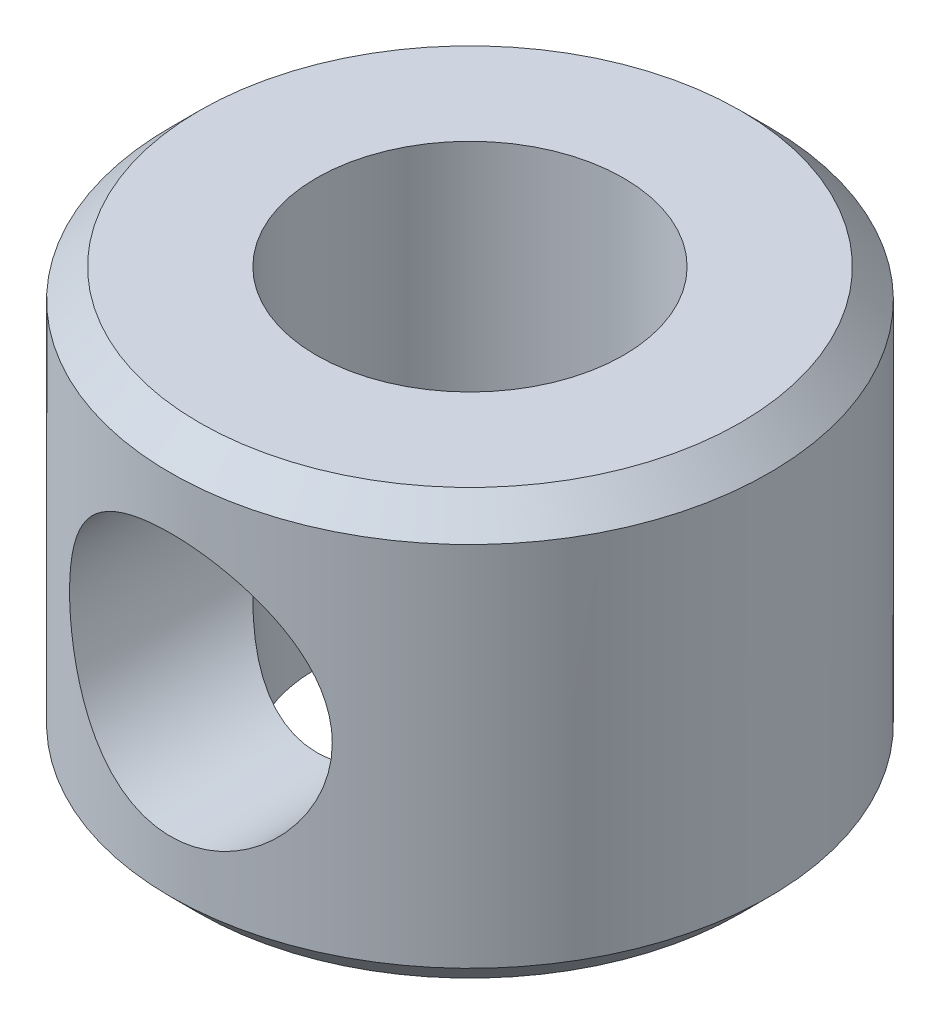
ISO-10303-21;
HEADER;
FILE_DESCRIPTION(('STEP AP214'),'2;1');
FILE_NAME('part.step','',(''),(''),'','','');
FILE_SCHEMA(('AUTOMOTIVE_DESIGN { 1 0 10303 214 1 1 1 1 }'));
ENDSEC;
DATA;
#1=APPLICATION_CONTEXT('core data for automotive mechanical design processes');
#2=APPLICATION_PROTOCOL_DEFINITION('international standard','automotive_design',2000,#1);
#3=PRODUCT_CONTEXT('',#1,'mechanical');
#4=PRODUCT('Part','Part','',(#3));
#5=PRODUCT_RELATED_PRODUCT_CATEGORY('part','',(#4));
#6=PRODUCT_DEFINITION_FORMATION('','',#4);
#7=PRODUCT_DEFINITION_CONTEXT('part definition',#1,'design');
#8=PRODUCT_DEFINITION('design','',#6,#7);
#9=PRODUCT_DEFINITION_SHAPE('','',#8);
#10=(LENGTH_UNIT() NAMED_UNIT(*) SI_UNIT(.MILLI.,.METRE.));
#11=(NAMED_UNIT(*) PLANE_ANGLE_UNIT() SI_UNIT($,.RADIAN.));
#12=(NAMED_UNIT(*) SI_UNIT($,.STERADIAN.) SOLID_ANGLE_UNIT());
#13=UNCERTAINTY_MEASURE_WITH_UNIT(LENGTH_MEASURE(1.E-05),#10,'distance_accuracy_value','');
#14=(GEOMETRIC_REPRESENTATION_CONTEXT(3) GLOBAL_UNCERTAINTY_ASSIGNED_CONTEXT((#13)) GLOBAL_UNIT_ASSIGNED_CONTEXT((#10,
#11,#12)) REPRESENTATION_CONTEXT('',''));
#15=CARTESIAN_POINT('',(0.,0.,0.));
#16=DIRECTION('',(0.,0.,1.));
#17=DIRECTION('',(1.,0.,0.));
#18=AXIS2_PLACEMENT_3D('',#15,#16,#17);
#19=CARTESIAN_POINT('',(0.,5.588,0.));
#20=DIRECTION('',(0.,1.,0.));
#21=DIRECTION('',(0.,0.,1.));
#22=AXIS2_PLACEMENT_3D('',#19,#20,#21);
#23=PLANE('',#22);
#24=CARTESIAN_POINT('',(0.,5.588,0.));
#25=DIRECTION('',(0.,1.,0.));
#26=DIRECTION('',(0.,0.,1.));
#27=AXIS2_PLACEMENT_3D('',#24,#25,#26);
#28=CIRCLE('',#27,3.556);
#29=CARTESIAN_POINT('',(0.,5.588,-3.556));
#30=VERTEX_POINT('',#29);
#31=EDGE_CURVE('E10',#30,#30,#28,.T.);
#32=ORIENTED_EDGE('',*,*,#31,.T.);
#33=EDGE_LOOP('',(#32));
#34=FACE_BOUND('',#33,.T.);
#35=CARTESIAN_POINT('',(0.,5.588,0.));
#36=DIRECTION('',(0.,1.,0.));
#37=DIRECTION('',(0.,0.,1.));
#38=AXIS2_PLACEMENT_3D('',#35,#36,#37);
#39=CIRCLE('',#38,2.0193);
#40=CARTESIAN_POINT('',(0.,5.588,2.0193));
#41=VERTEX_POINT('',#40);
#42=EDGE_CURVE('E53',#41,#41,#39,.T.);
#43=ORIENTED_EDGE('',*,*,#42,.F.);
#44=EDGE_LOOP('',(#43));
#45=FACE_BOUND('',#44,.T.);
#46=ADVANCED_FACE('F33',(#34,#45),#23,.T.);
#47=CARTESIAN_POINT('',(0.,0.,0.));
#48=DIRECTION('',(0.,1.,0.));
#49=DIRECTION('',(0.,0.,1.));
#50=AXIS2_PLACEMENT_3D('',#47,#48,#49);
#51=PLANE('',#50);
#52=CARTESIAN_POINT('',(0.,0.,0.));
#53=DIRECTION('',(0.,1.,0.));
#54=DIRECTION('',(0.,0.,1.));
#55=AXIS2_PLACEMENT_3D('',#52,#53,#54);
#56=CIRCLE('',#55,3.556);
#57=CARTESIAN_POINT('',(0.,0.,3.556));
#58=VERTEX_POINT('',#57);
#59=EDGE_CURVE('E40',#58,#58,#56,.F.);
#60=ORIENTED_EDGE('',*,*,#59,.T.);
#61=EDGE_LOOP('',(#60));
#62=FACE_BOUND('',#61,.T.);
#63=CARTESIAN_POINT('',(0.,0.,0.));
#64=DIRECTION('',(0.,1.,0.));
#65=DIRECTION('',(0.,0.,1.));
#66=AXIS2_PLACEMENT_3D('',#63,#64,#65);
#67=CIRCLE('',#66,2.0193);
#68=CARTESIAN_POINT('',(0.,0.,2.0193));
#69=VERTEX_POINT('',#68);
#70=EDGE_CURVE('E54',#69,#69,#67,.T.);
#71=ORIENTED_EDGE('',*,*,#70,.T.);
#72=EDGE_LOOP('',(#71));
#73=FACE_BOUND('',#72,.T.);
#74=ADVANCED_FACE('F86',(#62,#73),#51,.F.);
#75=CARTESIAN_POINT('',(0.,5.588,0.));
#76=DIRECTION('',(0.,-1.,0.));
#77=DIRECTION('',(0.,0.,-1.));
#78=AXIS2_PLACEMENT_3D('',#75,#76,#77);
#79=CYLINDRICAL_SURFACE('',#78,3.937);
#80=CARTESIAN_POINT('',(0.,0.381,0.));
#81=DIRECTION('',(0.,1.,0.));
#82=DIRECTION('',(0.,0.,1.));
#83=AXIS2_PLACEMENT_3D('',#80,#81,#82);
#84=CIRCLE('',#83,3.937);
#85=CARTESIAN_POINT('',(0.,0.381,3.937));
#86=VERTEX_POINT('',#85);
#87=EDGE_CURVE('E44',#86,#86,#84,.T.);
#88=ORIENTED_EDGE('',*,*,#87,.T.);
#89=EDGE_LOOP('',(#88));
#90=FACE_BOUND('',#89,.T.);
#91=CARTESIAN_POINT('',(0.,5.207,0.));
#92=DIRECTION('',(0.,1.,0.));
#93=DIRECTION('',(0.,0.,1.));
#94=AXIS2_PLACEMENT_3D('',#91,#92,#93);
#95=CIRCLE('',#94,3.937);
#96=CARTESIAN_POINT('',(0.,5.207,-3.937));
#97=VERTEX_POINT('',#96);
#98=EDGE_CURVE('E48',#97,#97,#95,.F.);
#99=ORIENTED_EDGE('',*,*,#98,.T.);
#100=EDGE_LOOP('',(#99));
#101=FACE_BOUND('',#100,.T.);
#102=CARTESIAN_POINT('',(1.72719999999999,2.794,3.53790180191593));
#103=CARTESIAN_POINT('',(1.72719578136646,2.7024016376137,3.53790636194648));
#104=CARTESIAN_POINT('',(1.71986710918652,2.6106517595193,3.54151059319829));
#105=CARTESIAN_POINT('',(1.69086860020965,2.42984349216496,3.55544353198954));
#106=CARTESIAN_POINT('',(1.66916183869725,2.34079265176102,3.56578955216563));
#107=CARTESIAN_POINT('',(1.61243634088037,2.16832231428566,3.59179310471308));
#108=CARTESIAN_POINT('',(1.5774758819706,2.08488002048414,3.60742735241412));
#109=CARTESIAN_POINT('',(1.49541007958023,1.92506699405684,3.6422104236138));
#110=CARTESIAN_POINT('',(1.44830669578914,1.8486951230693,3.6613586798596));
#111=CARTESIAN_POINT('',(1.33981128716781,1.6998665551408,3.70249124734506));
#112=CARTESIAN_POINT('',(1.27770800995274,1.62795643599403,3.72457812940021));
#113=CARTESIAN_POINT('',(1.14246583943478,1.49516265372648,3.76826075428827));
#114=CARTESIAN_POINT('',(1.06932243577436,1.4342835197004,3.78985629221771));
#115=CARTESIAN_POINT('',(0.90967961967382,1.32238264123839,3.83139303842346));
#116=CARTESIAN_POINT('',(0.822701328527197,1.27199021163004,3.85120130221964));
#117=CARTESIAN_POINT('',(0.64047404873173,1.18679308312858,3.88565812756723));
#118=CARTESIAN_POINT('',(0.545229137933002,1.15198075030437,3.90030921527728));
#119=CARTESIAN_POINT('',(0.354924766947638,1.10095767953889,3.92207088635899));
#120=CARTESIAN_POINT('',(0.26016365351529,1.08380048754502,3.92956338360354));
#121=CARTESIAN_POINT('',(0.068831711034894,1.06550187829506,3.93756049135947));
#122=CARTESIAN_POINT('',(-0.0277382788653182,1.06435321025091,3.93806826548077));
#123=CARTESIAN_POINT('',(-0.213008429663193,1.07764025899984,3.9322529791292));
#124=CARTESIAN_POINT('',(-0.301800658783986,1.09103181482094,3.92638756823651));
#125=CARTESIAN_POINT('',(-0.475727982981354,1.13120993901653,3.90912933956156));
#126=CARTESIAN_POINT('',(-0.560862806883595,1.15799749876825,3.89773611269267));
#127=CARTESIAN_POINT('',(-0.726636705184765,1.22450311346268,3.87028955957733));
#128=CARTESIAN_POINT('',(-0.807187197493588,1.26441250894124,3.85416768107325));
#129=CARTESIAN_POINT('',(-0.960659755835133,1.3558279801198,3.81881043414929));
#130=CARTESIAN_POINT('',(-1.03357903895009,1.40733826494881,3.79957393637176));
#131=CARTESIAN_POINT('',(-1.17568586735925,1.52508749736695,3.75814097959596));
#132=CARTESIAN_POINT('',(-1.24415493471844,1.59215459991236,3.7358306567057));
#133=CARTESIAN_POINT('',(-1.36920556647099,1.73681324990128,3.69183539022855));
#134=CARTESIAN_POINT('',(-1.42578150537489,1.81440974935861,3.67015074675508));
#135=CARTESIAN_POINT('',(-1.5275765085432,1.98178393487086,3.62899698396181));
#136=CARTESIAN_POINT('',(-1.57225503845083,2.07192310389925,3.60965012153974));
#137=CARTESIAN_POINT('',(-1.64549814918542,2.25951658594628,3.57686088290184));
#138=CARTESIAN_POINT('',(-1.67407569424658,2.35696494188245,3.56341375825564));
#139=CARTESIAN_POINT('',(-1.71237063120555,2.54919156019454,3.54516267760276));
#140=CARTESIAN_POINT('',(-1.72326183658091,2.64368391228285,3.53982248771774));
#141=CARTESIAN_POINT('',(-1.72935306428755,2.83327684376396,3.53685232051194));
#142=CARTESIAN_POINT('',(-1.72455957883244,2.92837715524563,3.53921915309534));
#143=CARTESIAN_POINT('',(-1.70049133957573,3.10901486473081,3.55083766610458));
#144=CARTESIAN_POINT('',(-1.68231968815421,3.19473758168268,3.55956441154722));
#145=CARTESIAN_POINT('',(-1.63351557432935,3.36182623868922,3.58222195583448));
#146=CARTESIAN_POINT('',(-1.60287998010348,3.44319107791814,3.59615406256151));
#147=CARTESIAN_POINT('',(-1.52852592105124,3.60329833461787,3.62839959101938));
#148=CARTESIAN_POINT('',(-1.48428777169807,3.68176467785478,3.64687983482992));
#149=CARTESIAN_POINT('',(-1.38448299933918,3.83056212126743,3.68592523967092));
#150=CARTESIAN_POINT('',(-1.32891112751769,3.90088942839467,3.70649136447748));
#151=CARTESIAN_POINT('',(-1.20199730573941,4.0381632954515,3.74967466595703));
#152=CARTESIAN_POINT('',(-1.12967438166987,4.10420214031616,3.77230631513249));
#153=CARTESIAN_POINT('',(-0.974478692303475,4.22339987476971,3.8153425855803));
#154=CARTESIAN_POINT('',(-0.891604602576628,4.27655714496887,3.83574692667262));
#155=CARTESIAN_POINT('',(-0.71659860010883,4.36865763623596,3.87227219045223));
#156=CARTESIAN_POINT('',(-0.624404603804402,4.4074962739555,3.88836137166293));
#157=CARTESIAN_POINT('',(-0.43389575520815,4.46879807590547,3.91419438820192));
#158=CARTESIAN_POINT('',(-0.335585033118831,4.49127216248817,3.92394245537765));
#159=CARTESIAN_POINT('',(-0.143699254144386,4.51772530270832,3.93546075025208));
#160=CARTESIAN_POINT('',(-0.050332096822271,4.52298012034782,3.93778096815972));
#161=CARTESIAN_POINT('',(0.135942220138784,4.51835888254217,3.9357536199203));
#162=CARTESIAN_POINT('',(0.228849472690083,4.50848601982432,3.9314074607253));
#163=CARTESIAN_POINT('',(0.4074768244704,4.47480234020419,3.91683939650717));
#164=CARTESIAN_POINT('',(0.493334611123565,4.45160072956129,3.90687464268251));
#165=CARTESIAN_POINT('',(0.659880986397444,4.39261995510419,3.8822183589674));
#166=CARTESIAN_POINT('',(0.740568648638172,4.35683854465773,3.86752598480881));
#167=CARTESIAN_POINT('',(0.898572300571057,4.27190357505996,3.83397428269574));
#168=CARTESIAN_POINT('',(0.97556452291919,4.22221254260366,3.81495490369934));
#169=CARTESIAN_POINT('',(1.12045489924413,4.11161737707065,3.77494487103505));
#170=CARTESIAN_POINT('',(1.18834926878758,4.05070860261028,3.75395340317555));
#171=CARTESIAN_POINT('',(1.31854250583964,3.91393214710406,3.71032120627444));
#172=CARTESIAN_POINT('',(1.38001508811418,3.83727624771165,3.68767724355635));
#173=CARTESIAN_POINT('',(1.48939181065832,3.67410187577887,3.64487893170298));
#174=CARTESIAN_POINT('',(1.53728770725598,3.58757745565737,3.62472609933481));
#175=CARTESIAN_POINT('',(1.61796147485701,3.4065811385561,3.58944596972011));
#176=CARTESIAN_POINT('',(1.65071375496308,3.31209610524189,3.57432719139729));
#177=CARTESIAN_POINT('',(1.69941888583905,3.11821678372103,3.5514350225845));
#178=CARTESIAN_POINT('',(1.71542809978052,3.01884015326411,3.5436369969474));
#179=CARTESIAN_POINT('',(1.72418701747825,2.89809974890275,3.53937088038802));
#180=CARTESIAN_POINT('',(1.72531580476767,2.8773019836575,3.53882111859567));
#181=CARTESIAN_POINT('',(1.72682278456591,2.83567209375932,3.538086056429));
#182=CARTESIAN_POINT('',(1.72720095980088,2.81483996832671,3.53790076444223));
#183=CARTESIAN_POINT('',(1.72719999999999,2.794,3.53790180191593));
#184=B_SPLINE_CURVE_WITH_KNOTS('',3,(#102,#103,#104,#105,#106,#107,#108,#109,#110,#111,#112,
#113,#114,#115,#116,#117,#118,#119,#120,#121,#122,#123,#124,#125,#126,#127,#128,#129,#130,#131,
#132,#133,#134,#135,#136,#137,#138,#139,#140,#141,#142,#143,#144,#145,#146,#147,#148,#149,#150,
#151,#152,#153,#154,#155,#156,#157,#158,#159,#160,#161,#162,#163,#164,#165,#166,#167,#168,#169,
#170,#171,#172,#173,#174,#175,#176,#177,#178,#179,#180,#181,#182,#183),.UNSPECIFIED.,.T.,.F.,(4,
2,2,2,2,2,2,2,2,2,2,2,2,2,2,2,2,2,2,2,2,2,2,2,2,2,2,2,2,2,2,2,2,2,2,2,2,2,2,2,4),(0.,
0.274707349570184,0.550122931179516,0.824341280022262,1.09851540173043,1.38989763764,
1.68139923932117,1.98718684994987,2.2928244663811,2.58105601742246,2.86915701465083,
3.13785883425388,3.40658054219792,3.67940869248241,3.95233599242769,4.24625671662661,
4.54031615503514,4.84605898564152,5.1515552843027,5.43579764084229,5.71992235855569,
5.98292386092073,6.24599148868849,6.52071898542373,6.79557400265047,7.09573985532693,
7.39594342339421,7.69829816531184,8.00045091820807,8.27964102726499,8.5587722208047,
8.8260590333658,9.09339360507067,9.37297436219694,9.65267105787219,9.95378020021283,
10.2550717842615,10.5568706707,10.8576502910953,10.920148796227,10.9826487396213),.UNSPECIFIED.);
#185=CARTESIAN_POINT('',(1.72719999999999,2.794,3.53790180191593));
#186=VERTEX_POINT('',#185);
#187=EDGE_CURVE('E57',#186,#186,#184,.T.);
#188=ORIENTED_EDGE('',*,*,#187,.T.);
#189=EDGE_LOOP('',(#188));
#190=FACE_BOUND('',#189,.T.);
#191=ADVANCED_FACE('F70',(#90,#101,#190),#79,.T.);
#192=CARTESIAN_POINT('',(0.,5.588,0.));
#193=DIRECTION('',(0.,-1.,0.));
#194=DIRECTION('',(0.,0.,-1.));
#195=AXIS2_PLACEMENT_3D('',#192,#193,#194);
#196=CYLINDRICAL_SURFACE('',#195,2.0193);
#197=CARTESIAN_POINT('',(1.72719999999999,2.794,1.04611311529873));
#198=CARTESIAN_POINT('',(1.72719490143661,2.73576844309427,1.0461274647811));
#199=CARTESIAN_POINT('',(1.72421647459769,2.67745150228154,1.05108699554495));
#200=CARTESIAN_POINT('',(1.71263466632947,2.56279314984262,1.06984301581214));
#201=CARTESIAN_POINT('',(1.70401293312214,2.50645881757991,1.08366833347032));
#202=CARTESIAN_POINT('',(1.67724024625527,2.37404361964166,1.12483314526991));
#203=CARTESIAN_POINT('',(1.65661655816458,2.29950435504454,1.1554025127468));
#204=CARTESIAN_POINT('',(1.60704987172466,2.15652346638667,1.22341472312371));
#205=CARTESIAN_POINT('',(1.5780770744767,2.08810485460568,1.26088200935185));
#206=CARTESIAN_POINT('',(1.52048869376134,1.97277581905698,1.3293546707161));
#207=CARTESIAN_POINT('',(1.49348482228963,1.92466846647927,1.35972840268099));
#208=CARTESIAN_POINT('',(1.43522140348022,1.83151298131925,1.42109338454971));
#209=CARTESIAN_POINT('',(1.40395979099097,1.78646634928302,1.45208492784788));
#210=CARTESIAN_POINT('',(1.30389310652754,1.65597755406202,1.54455457116541));
#211=CARTESIAN_POINT('',(1.22869930617726,1.57497353180294,1.60566260531388));
#212=CARTESIAN_POINT('',(1.07991538492477,1.44324043787693,1.70810850186691));
#213=CARTESIAN_POINT('',(1.00967138766211,1.38978186589409,1.75082455298089));
#214=CARTESIAN_POINT('',(0.859102228107089,1.29295315083882,1.82939544702507));
#215=CARTESIAN_POINT('',(0.778794101179817,1.24956630541883,1.86526163159258));
#216=CARTESIAN_POINT('',(0.624484849790804,1.18185857454801,1.92173734733727));
#217=CARTESIAN_POINT('',(0.5519589883456,1.15551025579397,1.94393189136831));
#218=CARTESIAN_POINT('',(0.402162290921864,1.11246987071728,1.98034416439809));
#219=CARTESIAN_POINT('',(0.324894280399367,1.09577211503297,1.99456659310245));
#220=CARTESIAN_POINT('',(0.167278771640995,1.07306934181262,2.01393134755255));
#221=CARTESIAN_POINT('',(0.0869185133912104,1.06711491798176,2.01903070898169));
#222=CARTESIAN_POINT('',(-0.0738748698904806,1.06650970809209,2.01954822723441));
#223=CARTESIAN_POINT('',(-0.154307986575374,1.07185775918797,2.01496737999784));
#224=CARTESIAN_POINT('',(-0.30651176777202,1.09261191459636,1.99726019406774));
#225=CARTESIAN_POINT('',(-0.378475136297033,1.10721950167716,1.98481250475286));
#226=CARTESIAN_POINT('',(-0.518505455399061,1.14486905171416,1.95291727008299));
#227=CARTESIAN_POINT('',(-0.586571773001247,1.16791238036883,1.93346859131623));
#228=CARTESIAN_POINT('',(-0.722718146575938,1.22342224602244,1.88701287788926));
#229=CARTESIAN_POINT('',(-0.790395660696693,1.25647776553297,1.85953914599945));
#230=CARTESIAN_POINT('',(-0.919175572180646,1.32981512476743,1.79937547122005));
#231=CARTESIAN_POINT('',(-0.980273042002485,1.37010232063299,1.76668166407838));
#232=CARTESIAN_POINT('',(-1.12452557626685,1.47855174063176,1.68023611914563));
#233=CARTESIAN_POINT('',(-1.2033919847821,1.5505659561039,1.62414172715919));
#234=CARTESIAN_POINT('',(-1.34574716159196,1.70617490164575,1.50829814457541));
#235=CARTESIAN_POINT('',(-1.4091995216346,1.78979633060972,1.44854071046531));
#236=CARTESIAN_POINT('',(-1.50868060943899,1.94905281911696,1.34369173330451));
#237=CARTESIAN_POINT('',(-1.54767191808622,2.02258645224114,1.29819089110842));
#238=CARTESIAN_POINT('',(-1.6154920468163,2.17715090068543,1.2127220715442));
#239=CARTESIAN_POINT('',(-1.64435192831964,2.25815782226011,1.17273741533149));
#240=CARTESIAN_POINT('',(-1.68129348028555,2.39486136677585,1.11868318824412));
#241=CARTESIAN_POINT('',(-1.69308073587456,2.44793677224035,1.10061279276609));
#242=CARTESIAN_POINT('',(-1.71171473137371,2.55675606697509,1.0714041915265));
#243=CARTESIAN_POINT('',(-1.7185741086381,2.61249273678443,1.06024826404748));
#244=CARTESIAN_POINT('',(-1.72680872558659,2.72607478038002,1.04679404895471));
#245=CARTESIAN_POINT('',(-1.72812781343399,2.78393577726538,1.04458646219577));
#246=CARTESIAN_POINT('',(-1.72496527685295,2.89907729951752,1.04979603891814));
#247=CARTESIAN_POINT('',(-1.72047835966395,2.9563572472016,1.05722198435368));
#248=CARTESIAN_POINT('',(-1.70485726089911,3.07893384003803,1.08225660934474));
#249=CARTESIAN_POINT('',(-1.69264181031349,3.14373964754103,1.10150252925887));
#250=CARTESIAN_POINT('',(-1.66183112217624,3.26911845427127,1.14745306152499));
#251=CARTESIAN_POINT('',(-1.64321321595574,3.32967548022376,1.17418411256654));
#252=CARTESIAN_POINT('',(-1.6039536616854,3.43683849816527,1.22711364818897));
#253=CARTESIAN_POINT('',(-1.5841617938252,3.48409104889836,1.25266312041268));
#254=CARTESIAN_POINT('',(-1.54092013319274,3.57589479045454,1.3054910818216));
#255=CARTESIAN_POINT('',(-1.51746803449672,3.62044425360868,1.33277065448415));
#256=CARTESIAN_POINT('',(-1.44175877913802,3.75036077822291,1.41580106941501));
#257=CARTESIAN_POINT('',(-1.38416740901084,3.83194598772611,1.47271659563318));
#258=CARTESIAN_POINT('',(-1.25183935131221,3.98862438081292,1.586985946746));
#259=CARTESIAN_POINT('',(-1.17640838674602,4.06321303392495,1.64422793975457));
#260=CARTESIAN_POINT('',(-1.01005483408408,4.19915760541749,1.75130866623137));
#261=CARTESIAN_POINT('',(-0.919178120136324,4.26055152375821,1.80116852713173));
#262=CARTESIAN_POINT('',(-0.752956187688139,4.35036307633038,1.87515161726863));
#263=CARTESIAN_POINT('',(-0.681379707613602,4.38312138680302,1.90248013885099));
#264=CARTESIAN_POINT('',(-0.532188900298439,4.4390911319054,1.94947277097149));
#265=CARTESIAN_POINT('',(-0.454578966911894,4.46230943799779,1.96914239751277));
#266=CARTESIAN_POINT('',(-0.294575988902298,4.4978777484021,1.99936576238263));
#267=CARTESIAN_POINT('',(-0.212154406397581,4.51015396763746,2.00985760406));
#268=CARTESIAN_POINT('',(-0.0457424074274087,4.52260561810379,2.02049960153998));
#269=CARTESIAN_POINT('',(0.0382472982499816,4.52278640477256,2.02065433425565));
#270=CARTESIAN_POINT('',(0.196058907830568,4.51166855296847,2.01115194656767));
#271=CARTESIAN_POINT('',(0.270032274129017,4.50155797538892,2.00251029977445));
#272=CARTESIAN_POINT('',(0.41481189027256,4.47227542740758,1.97760005443318));
#273=CARTESIAN_POINT('',(0.485617555072446,4.45310179064349,1.9613300533166));
#274=CARTESIAN_POINT('',(0.624927346670907,4.40591881735329,1.92157945031347));
#275=CARTESIAN_POINT('',(0.693270389573676,4.37763019604139,1.89787165673569));
#276=CARTESIAN_POINT('',(0.824038537444521,4.31369914287655,1.84486311685234));
#277=CARTESIAN_POINT('',(0.886461779339075,4.27805440705133,1.81556061847262));
#278=CARTESIAN_POINT('',(1.03338089505182,4.18192023354493,1.73768065183247));
#279=CARTESIAN_POINT('',(1.11411832311009,4.11771071485898,1.68659571672738));
#280=CARTESIAN_POINT('',(1.2616332317572,3.97801420604313,1.57930302438182));
#281=CARTESIAN_POINT('',(1.32835815766494,3.90248651852689,1.52307707804329));
#282=CARTESIAN_POINT('',(1.41840568785346,3.78088816709409,1.43786585355415));
#283=CARTESIAN_POINT('',(1.44698114360001,3.73850484809286,1.40902442580798));
#284=CARTESIAN_POINT('',(1.50044957520708,3.65103103031396,1.35194317940245));
#285=CARTESIAN_POINT('',(1.5253407457004,3.60593921943962,1.32370366145335));
#286=CARTESIAN_POINT('',(1.57124125363315,3.51309288507351,1.268876115692));
#287=CARTESIAN_POINT('',(1.5922632247163,3.46534771500348,1.24228290819672));
#288=CARTESIAN_POINT('',(1.63027792787041,3.36688212380661,1.19195588383812));
#289=CARTESIAN_POINT('',(1.64727564912009,3.31616548504447,1.16821854448851));
#290=CARTESIAN_POINT('',(1.67716243713512,3.2104463179086,1.12490195503999));
#291=CARTESIAN_POINT('',(1.68995918656485,3.15537681008275,1.10541893240029));
#292=CARTESIAN_POINT('',(1.71021129684565,3.04231188126822,1.07383106224524));
#293=CARTESIAN_POINT('',(1.71768938073446,2.98433005453405,1.06169486028756));
#294=CARTESIAN_POINT('',(1.72384607839945,2.90379644775402,1.0516344643562));
#295=CARTESIAN_POINT('',(1.72510068579278,2.88191368757558,1.04957290683701));
#296=CARTESIAN_POINT('',(1.72677874706906,2.83802471294631,1.04680929605864));
#297=CARTESIAN_POINT('',(1.72720192786388,2.81601846031283,1.04610768948626));
#298=CARTESIAN_POINT('',(1.72719999999999,2.794,1.04611311529873));
#299=B_SPLINE_CURVE_WITH_KNOTS('',3,(#197,#198,#199,#200,#201,#202,#203,#204,#205,#206,#207,
#208,#209,#210,#211,#212,#213,#214,#215,#216,#217,#218,#219,#220,#221,#222,#223,#224,#225,#226,
#227,#228,#229,#230,#231,#232,#233,#234,#235,#236,#237,#238,#239,#240,#241,#242,#243,#244,#245,
#246,#247,#248,#249,#250,#251,#252,#253,#254,#255,#256,#257,#258,#259,#260,#261,#262,#263,#264,
#265,#266,#267,#268,#269,#270,#271,#272,#273,#274,#275,#276,#277,#278,#279,#280,#281,#282,#283,
#284,#285,#286,#287,#288,#289,#290,#291,#292,#293,#294,#295,#296,#297,#298),.UNSPECIFIED.,.T.,
.F.,(4,2,2,2,2,2,2,2,2,2,2,2,2,2,2,2,2,2,2,2,2,2,2,2,2,2,2,2,2,2,2,2,2,2,2,2,2,2,2,2,2,2,2,2,2,
2,2,2,2,2,4),(0.,0.174594649546633,0.34975991289009,0.59784017076394,0.846817059839352,
1.03551613449905,1.22430706286045,1.60107676397295,1.89424759368795,2.18692871682637,
2.42681680591441,2.66656332751863,2.90743597237469,3.14828383646478,3.37075604783587,
3.59326429212909,3.83290640471296,4.07272674614636,4.43272147690684,4.79355842920102,
5.07742359369572,5.36041071003263,5.53176671909931,5.70268170825695,5.87532483320385,
6.04812545074213,6.2530707050615,6.45874919403824,6.63026490325519,6.80188910579447,
7.14531502914109,7.50534362424655,7.86432103861206,8.11334357838958,8.36218643675315,
8.61269487693474,8.86309239993807,9.08753270230785,9.31201428703224,9.54415912513515,
9.7763767828253,10.1198807511457,10.464650907376,10.6405836333275,10.8166022861397,
10.9920355946949,11.1672502523004,11.346091301137,11.5241636179369,11.5901595057585,
11.6561770667881),.UNSPECIFIED.);
#300=CARTESIAN_POINT('',(1.72719999999999,2.794,1.04611311529873));
#301=VERTEX_POINT('',#300);
#302=EDGE_CURVE('E66',#301,#301,#299,.T.);
#303=ORIENTED_EDGE('',*,*,#302,.F.);
#304=EDGE_LOOP('',(#303));
#305=FACE_BOUND('',#304,.T.);
#306=ORIENTED_EDGE('',*,*,#42,.T.);
#307=EDGE_LOOP('',(#306));
#308=FACE_BOUND('',#307,.T.);
#309=ORIENTED_EDGE('',*,*,#70,.F.);
#310=EDGE_LOOP('',(#309));
#311=FACE_BOUND('',#310,.T.);
#312=ADVANCED_FACE('F77',(#305,#308,#311),#196,.F.);
#313=CARTESIAN_POINT('',(0.,2.794,3.937));
#314=DIRECTION('',(0.,0.,1.));
#315=DIRECTION('',(1.,0.,0.));
#316=AXIS2_PLACEMENT_3D('',#313,#314,#315);
#317=CYLINDRICAL_SURFACE('',#316,1.72719999999999);
#318=ORIENTED_EDGE('',*,*,#302,.T.);
#319=EDGE_LOOP('',(#318));
#320=FACE_BOUND('',#319,.T.);
#321=ORIENTED_EDGE('',*,*,#187,.F.);
#322=EDGE_LOOP('',(#321));
#323=FACE_BOUND('',#322,.T.);
#324=ADVANCED_FACE('F73',(#320,#323),#317,.F.);
#325=CARTESIAN_POINT('',(0.,0.381,0.));
#326=DIRECTION('',(0.,1.,0.));
#327=DIRECTION('',(0.,0.,1.));
#328=AXIS2_PLACEMENT_3D('',#325,#326,#327);
#329=CONICAL_SURFACE('',#328,3.937,0.78539816339745);
#330=CARTESIAN_POINT('',(0.,0.,3.556));
#331=CARTESIAN_POINT('',(0.,0.00396875000000003,3.55996875));
#332=CARTESIAN_POINT('',(0.,0.00793750000000002,3.5639375));
#333=CARTESIAN_POINT('',(0.,0.015875,3.571875));
#334=CARTESIAN_POINT('',(0.,0.01984375,3.57584375));
#335=CARTESIAN_POINT('',(0.,0.02778125,3.58378125));
#336=CARTESIAN_POINT('',(0.,0.0317499999999999,3.58775));
#337=CARTESIAN_POINT('',(0.,0.0396875,3.5956875));
#338=CARTESIAN_POINT('',(0.,0.04365625,3.59965625));
#339=CARTESIAN_POINT('',(0.,0.05159375,3.60759375));
#340=CARTESIAN_POINT('',(0.,0.0555625,3.6115625));
#341=CARTESIAN_POINT('',(0.,0.0635,3.6195));
#342=CARTESIAN_POINT('',(0.,0.06746875,3.62346875));
#343=CARTESIAN_POINT('',(0.,0.07540625,3.63140625));
#344=CARTESIAN_POINT('',(0.,0.0793750000000001,3.635375));
#345=CARTESIAN_POINT('',(0.,0.0873125000000001,3.6433125));
#346=CARTESIAN_POINT('',(0.,0.09128125,3.64728125));
#347=CARTESIAN_POINT('',(0.,0.09921875,3.65521875));
#348=CARTESIAN_POINT('',(0.,0.1031875,3.6591875));
#349=CARTESIAN_POINT('',(0.,0.111125,3.667125));
#350=CARTESIAN_POINT('',(0.,0.11509375,3.67109375));
#351=CARTESIAN_POINT('',(0.,0.12303125,3.67903125));
#352=CARTESIAN_POINT('',(0.,0.127,3.683));
#353=CARTESIAN_POINT('',(0.,0.1349375,3.6909375));
#354=CARTESIAN_POINT('',(0.,0.13890625,3.69490625));
#355=CARTESIAN_POINT('',(0.,0.14684375,3.70284375));
#356=CARTESIAN_POINT('',(0.,0.1508125,3.7068125));
#357=CARTESIAN_POINT('',(0.,0.15875,3.71475));
#358=CARTESIAN_POINT('',(0.,0.16271875,3.71871875));
#359=CARTESIAN_POINT('',(0.,0.17065625,3.72665625));
#360=CARTESIAN_POINT('',(0.,0.174625,3.730625));
#361=CARTESIAN_POINT('',(0.,0.1825625,3.7385625));
#362=CARTESIAN_POINT('',(0.,0.18653125,3.74253125));
#363=CARTESIAN_POINT('',(0.,0.19446875,3.75046875));
#364=CARTESIAN_POINT('',(0.,0.1984375,3.7544375));
#365=CARTESIAN_POINT('',(0.,0.206375,3.762375));
#366=CARTESIAN_POINT('',(0.,0.21034375,3.76634375));
#367=CARTESIAN_POINT('',(0.,0.21828125,3.77428125));
#368=CARTESIAN_POINT('',(0.,0.22225,3.77825));
#369=CARTESIAN_POINT('',(0.,0.2301875,3.7861875));
#370=CARTESIAN_POINT('',(0.,0.23415625,3.79015625));
#371=CARTESIAN_POINT('',(0.,0.24209375,3.79809375));
#372=CARTESIAN_POINT('',(0.,0.2460625,3.8020625));
#373=CARTESIAN_POINT('',(0.,0.254,3.81));
#374=CARTESIAN_POINT('',(0.,0.25796875,3.81396875));
#375=CARTESIAN_POINT('',(0.,0.26590625,3.82190625));
#376=CARTESIAN_POINT('',(0.,0.269875,3.825875));
#377=CARTESIAN_POINT('',(0.,0.2778125,3.8338125));
#378=CARTESIAN_POINT('',(0.,0.28178125,3.83778125));
#379=CARTESIAN_POINT('',(0.,0.28971875,3.84571875));
#380=CARTESIAN_POINT('',(0.,0.2936875,3.8496875));
#381=CARTESIAN_POINT('',(0.,0.301625,3.857625));
#382=CARTESIAN_POINT('',(0.,0.30559375,3.86159375));
#383=CARTESIAN_POINT('',(0.,0.31353125,3.86953125));
#384=CARTESIAN_POINT('',(0.,0.3175,3.8735));
#385=CARTESIAN_POINT('',(0.,0.3254375,3.8814375));
#386=CARTESIAN_POINT('',(0.,0.32940625,3.88540625));
#387=CARTESIAN_POINT('',(0.,0.33734375,3.89334375));
#388=CARTESIAN_POINT('',(0.,0.3413125,3.8973125));
#389=CARTESIAN_POINT('',(0.,0.34925,3.90525));
#390=CARTESIAN_POINT('',(0.,0.35321875,3.90921875));
#391=CARTESIAN_POINT('',(0.,0.36115625,3.91715625));
#392=CARTESIAN_POINT('',(0.,0.365125,3.921125));
#393=CARTESIAN_POINT('',(0.,0.3730625,3.9290625));
#394=CARTESIAN_POINT('',(0.,0.37703125,3.93303125));
#395=CARTESIAN_POINT('',(0.,0.381,3.937));
#396=B_SPLINE_CURVE_WITH_KNOTS('',3,(#330,#331,#332,#333,#334,#335,#336,#337,#338,#339,#340,
#341,#342,#343,#344,#345,#346,#347,#348,#349,#350,#351,#352,#353,#354,#355,#356,#357,#358,#359,
#360,#361,#362,#363,#364,#365,#366,#367,#368,#369,#370,#371,#372,#373,#374,#375,#376,#377,#378,
#379,#380,#381,#382,#383,#384,#385,#386,#387,#388,#389,#390,#391,#392,#393,#394,#395),
.UNSPECIFIED.,.F.,.F.,(4,2,2,2,2,2,2,2,2,2,2,2,2,2,2,2,2,2,2,2,2,2,2,2,2,2,2,2,2,2,2,2,4),(0.,
0.0168379802270045,0.0336759604540093,0.0505139406810141,0.0673519209080186,0.0841899011350235,
0.101027881362028,0.117865861589033,0.134703841816038,0.151541822043042,0.168379802270047,
0.185217782497052,0.202055762724056,0.218893742951061,0.235731723178066,0.25256970340507,
0.269407683632075,0.28624566385908,0.303083644086085,0.319921624313089,0.336759604540094,
0.353597584767099,0.370435564994103,0.387273545221108,0.404111525448113,0.420949505675118,
0.437787485902122,0.454625466129127,0.471463446356131,0.488301426583136,0.505139406810141,
0.521977387037146,0.53881536726415),.UNSPECIFIED.);
#397=EDGE_CURVE('BSEAM76',#58,#86,#396,.T.);
#398=ORIENTED_EDGE('',*,*,#59,.F.);
#399=ORIENTED_EDGE('',*,*,#87,.F.);
#400=ORIENTED_EDGE('',*,*,#397,.T.);
#401=ORIENTED_EDGE('',*,*,#397,.F.);
#402=EDGE_LOOP('',(#398,#400,#399,#401));
#403=FACE_BOUND('',#402,.T.);
#404=ADVANCED_FACE('F76',(#403),#329,.T.);
#405=CARTESIAN_POINT('',(0.,5.588,0.));
#406=DIRECTION('',(0.,-1.,0.));
#407=DIRECTION('',(0.,0.,-1.));
#408=AXIS2_PLACEMENT_3D('',#405,#406,#407);
#409=CONICAL_SURFACE('',#408,3.556,0.785398163397447);
#410=CARTESIAN_POINT('',(0.,5.207,-3.937));
#411=CARTESIAN_POINT('',(0.,5.21096875,-3.93303125));
#412=CARTESIAN_POINT('',(0.,5.2149375,-3.9290625));
#413=CARTESIAN_POINT('',(0.,5.222875,-3.921125));
#414=CARTESIAN_POINT('',(0.,5.22684375,-3.91715625));
#415=CARTESIAN_POINT('',(0.,5.23478125,-3.90921875));
#416=CARTESIAN_POINT('',(0.,5.23875,-3.90525));
#417=CARTESIAN_POINT('',(0.,5.2466875,-3.8973125));
#418=CARTESIAN_POINT('',(0.,5.25065625,-3.89334375));
#419=CARTESIAN_POINT('',(0.,5.25859375,-3.88540625));
#420=CARTESIAN_POINT('',(0.,5.2625625,-3.8814375));
#421=CARTESIAN_POINT('',(0.,5.2705,-3.8735));
#422=CARTESIAN_POINT('',(0.,5.27446875,-3.86953125));
#423=CARTESIAN_POINT('',(0.,5.28240625,-3.86159375));
#424=CARTESIAN_POINT('',(0.,5.286375,-3.857625));
#425=CARTESIAN_POINT('',(0.,5.2943125,-3.8496875));
#426=CARTESIAN_POINT('',(0.,5.29828125,-3.84571875));
#427=CARTESIAN_POINT('',(0.,5.30621875,-3.83778125));
#428=CARTESIAN_POINT('',(0.,5.3101875,-3.8338125));
#429=CARTESIAN_POINT('',(0.,5.318125,-3.825875));
#430=CARTESIAN_POINT('',(0.,5.32209375,-3.82190625));
#431=CARTESIAN_POINT('',(0.,5.33003125,-3.81396875));
#432=CARTESIAN_POINT('',(0.,5.334,-3.81));
#433=CARTESIAN_POINT('',(0.,5.3419375,-3.8020625));
#434=CARTESIAN_POINT('',(0.,5.34590625,-3.79809375));
#435=CARTESIAN_POINT('',(0.,5.35384375,-3.79015625));
#436=CARTESIAN_POINT('',(0.,5.3578125,-3.7861875));
#437=CARTESIAN_POINT('',(0.,5.36575,-3.77825));
#438=CARTESIAN_POINT('',(0.,5.36971875,-3.77428125));
#439=CARTESIAN_POINT('',(0.,5.37765625,-3.76634375));
#440=CARTESIAN_POINT('',(0.,5.381625,-3.762375));
#441=CARTESIAN_POINT('',(0.,5.3895625,-3.7544375));
#442=CARTESIAN_POINT('',(0.,5.39353125,-3.75046875));
#443=CARTESIAN_POINT('',(0.,5.40146875,-3.74253125));
#444=CARTESIAN_POINT('',(0.,5.4054375,-3.7385625));
#445=CARTESIAN_POINT('',(0.,5.413375,-3.730625));
#446=CARTESIAN_POINT('',(0.,5.41734375,-3.72665625));
#447=CARTESIAN_POINT('',(0.,5.42528125,-3.71871875));
#448=CARTESIAN_POINT('',(0.,5.42925,-3.71475));
#449=CARTESIAN_POINT('',(0.,5.4371875,-3.7068125));
#450=CARTESIAN_POINT('',(0.,5.44115625,-3.70284375));
#451=CARTESIAN_POINT('',(0.,5.44909375,-3.69490625));
#452=CARTESIAN_POINT('',(0.,5.4530625,-3.6909375));
#453=CARTESIAN_POINT('',(0.,5.461,-3.683));
#454=CARTESIAN_POINT('',(0.,5.46496875,-3.67903125));
#455=CARTESIAN_POINT('',(0.,5.47290625,-3.67109375));
#456=CARTESIAN_POINT('',(0.,5.476875,-3.667125));
#457=CARTESIAN_POINT('',(0.,5.4848125,-3.6591875));
#458=CARTESIAN_POINT('',(0.,5.48878125,-3.65521875));
#459=CARTESIAN_POINT('',(0.,5.49671875,-3.64728125));
#460=CARTESIAN_POINT('',(0.,5.5006875,-3.6433125));
#461=CARTESIAN_POINT('',(0.,5.508625,-3.635375));
#462=CARTESIAN_POINT('',(0.,5.51259375,-3.63140625));
#463=CARTESIAN_POINT('',(0.,5.52053125,-3.62346875));
#464=CARTESIAN_POINT('',(0.,5.5245,-3.6195));
#465=CARTESIAN_POINT('',(0.,5.5324375,-3.6115625));
#466=CARTESIAN_POINT('',(0.,5.53640625,-3.60759375));
#467=CARTESIAN_POINT('',(0.,5.54434375,-3.59965625));
#468=CARTESIAN_POINT('',(0.,5.5483125,-3.5956875));
#469=CARTESIAN_POINT('',(0.,5.55625,-3.58775));
#470=CARTESIAN_POINT('',(0.,5.56021875,-3.58378125));
#471=CARTESIAN_POINT('',(0.,5.56815625,-3.57584375));
#472=CARTESIAN_POINT('',(0.,5.572125,-3.571875));
#473=CARTESIAN_POINT('',(0.,5.5800625,-3.5639375));
#474=CARTESIAN_POINT('',(0.,5.58403125,-3.55996875));
#475=CARTESIAN_POINT('',(0.,5.588,-3.556));
#476=B_SPLINE_CURVE_WITH_KNOTS('',3,(#410,#411,#412,#413,#414,#415,#416,#417,#418,#419,#420,
#421,#422,#423,#424,#425,#426,#427,#428,#429,#430,#431,#432,#433,#434,#435,#436,#437,#438,#439,
#440,#441,#442,#443,#444,#445,#446,#447,#448,#449,#450,#451,#452,#453,#454,#455,#456,#457,#458,
#459,#460,#461,#462,#463,#464,#465,#466,#467,#468,#469,#470,#471,#472,#473,#474,#475),
.UNSPECIFIED.,.F.,.F.,(4,2,2,2,2,2,2,2,2,2,2,2,2,2,2,2,2,2,2,2,2,2,2,2,2,2,2,2,2,2,2,2,4),(0.,
0.0168379802270056,0.0336759604540099,0.0505139406810142,0.0673519209080195,0.0841899011350238,
0.101027881362028,0.117865861589033,0.134703841816038,0.151541822043042,0.168379802270047,
0.185217782497052,0.202055762724057,0.218893742951061,0.235731723178066,0.25256970340507,
0.269407683632075,0.286245663859079,0.303083644086085,0.319921624313089,0.336759604540094,
0.353597584767098,0.370435564994103,0.387273545221108,0.404111525448112,0.420949505675117,
0.437787485902122,0.454625466129126,0.471463446356131,0.488301426583136,0.50513940681014,
0.521977387037144,0.53881536726415),.UNSPECIFIED.);
#477=EDGE_CURVE('BSEAM35',#97,#30,#476,.T.);
#478=ORIENTED_EDGE('',*,*,#98,.F.);
#479=ORIENTED_EDGE('',*,*,#31,.F.);
#480=ORIENTED_EDGE('',*,*,#477,.T.);
#481=ORIENTED_EDGE('',*,*,#477,.F.);
#482=EDGE_LOOP('',(#478,#480,#479,#481));
#483=FACE_BOUND('',#482,.T.);
#484=ADVANCED_FACE('F35',(#483),#409,.T.);
#485=CLOSED_SHELL('',(#46,#74,#191,#312,#324,#404,#484));
#486=MANIFOLD_SOLID_BREP('B2',#485);
#487=ADVANCED_BREP_SHAPE_REPRESENTATION('',(#18,#486),#14);
#488=SHAPE_DEFINITION_REPRESENTATION(#9,#487);
ENDSEC;
END-ISO-10303-21;
